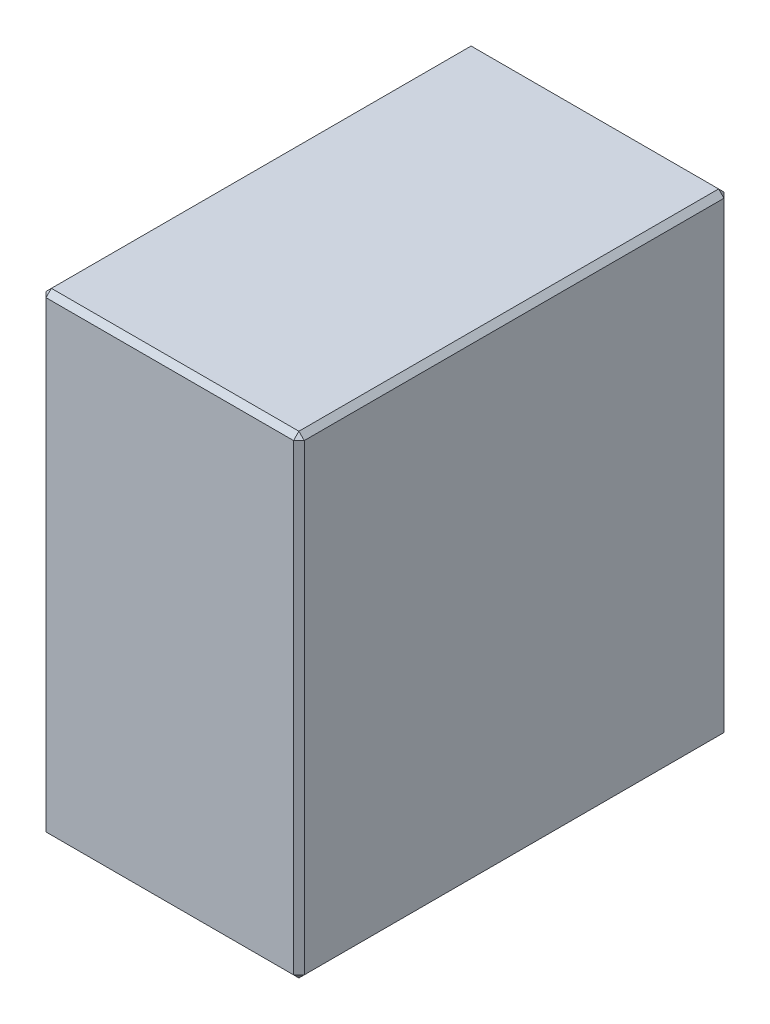
ISO-10303-21;
HEADER;
FILE_DESCRIPTION(('STEP AP214'),'2;1');
FILE_NAME('part.step','',(''),(''),'','','');
FILE_SCHEMA(('AUTOMOTIVE_DESIGN { 1 0 10303 214 1 1 1 1 }'));
ENDSEC;
DATA;
#1=APPLICATION_CONTEXT('core data for automotive mechanical design processes');
#2=APPLICATION_PROTOCOL_DEFINITION('international standard','automotive_design',2000,#1);
#3=PRODUCT_CONTEXT('',#1,'mechanical');
#4=PRODUCT('Part','Part','',(#3));
#5=PRODUCT_RELATED_PRODUCT_CATEGORY('part','',(#4));
#6=PRODUCT_DEFINITION_FORMATION('','',#4);
#7=PRODUCT_DEFINITION_CONTEXT('part definition',#1,'design');
#8=PRODUCT_DEFINITION('design','',#6,#7);
#9=PRODUCT_DEFINITION_SHAPE('','',#8);
#10=(LENGTH_UNIT() NAMED_UNIT(*) SI_UNIT(.MILLI.,.METRE.));
#11=(NAMED_UNIT(*) PLANE_ANGLE_UNIT() SI_UNIT($,.RADIAN.));
#12=(NAMED_UNIT(*) SI_UNIT($,.STERADIAN.) SOLID_ANGLE_UNIT());
#13=UNCERTAINTY_MEASURE_WITH_UNIT(LENGTH_MEASURE(1.E-05),#10,'distance_accuracy_value','');
#14=(GEOMETRIC_REPRESENTATION_CONTEXT(3) GLOBAL_UNCERTAINTY_ASSIGNED_CONTEXT((#13)) GLOBAL_UNIT_ASSIGNED_CONTEXT((#10,
#11,#12)) REPRESENTATION_CONTEXT('',''));
#15=CARTESIAN_POINT('',(0.,0.,0.));
#16=DIRECTION('',(0.,0.,1.));
#17=DIRECTION('',(1.,0.,0.));
#18=AXIS2_PLACEMENT_3D('',#15,#16,#17);
#19=CARTESIAN_POINT('',(-12.,22.,0.));
#20=DIRECTION('',(0.,0.,1.));
#21=DIRECTION('',(1.,0.,0.));
#22=AXIS2_PLACEMENT_3D('',#19,#20,#21);
#23=PLANE('',#22);
#24=DIRECTION('',(0.,1.,0.));
#25=VECTOR('',#24,1.);
#26=CARTESIAN_POINT('',(-0.250000000000004,22.,0.));
#27=LINE('',#26,#25);
#28=CARTESIAN_POINT('',(-0.250000000000004,0.250000000000004,0.));
#29=VERTEX_POINT('',#28);
#30=CARTESIAN_POINT('',(-0.250000000000004,21.75,0.));
#31=VERTEX_POINT('',#30);
#32=EDGE_CURVE('E182',#29,#31,#27,.T.);
#33=ORIENTED_EDGE('',*,*,#32,.T.);
#34=DIRECTION('',(-1.,0.,0.));
#35=VECTOR('',#34,1.);
#36=CARTESIAN_POINT('',(-12.,21.75,0.));
#37=LINE('',#36,#35);
#38=CARTESIAN_POINT('',(-11.75,21.75,0.));
#39=VERTEX_POINT('',#38);
#40=EDGE_CURVE('E186',#31,#39,#37,.T.);
#41=ORIENTED_EDGE('',*,*,#40,.T.);
#42=DIRECTION('',(0.,-1.,0.));
#43=VECTOR('',#42,1.);
#44=CARTESIAN_POINT('',(-11.75,0.,0.));
#45=LINE('',#44,#43);
#46=CARTESIAN_POINT('',(-11.75,0.250000000000004,0.));
#47=VERTEX_POINT('',#46);
#48=EDGE_CURVE('E184',#39,#47,#45,.T.);
#49=ORIENTED_EDGE('',*,*,#48,.T.);
#50=DIRECTION('',(1.,0.,0.));
#51=VECTOR('',#50,1.);
#52=CARTESIAN_POINT('',(-12.,0.250000000000004,0.));
#53=LINE('',#52,#51);
#54=EDGE_CURVE('E180',#47,#29,#53,.T.);
#55=ORIENTED_EDGE('',*,*,#54,.T.);
#56=EDGE_LOOP('',(#33,#41,#49,#55));
#57=FACE_BOUND('',#56,.T.);
#58=ADVANCED_FACE('F43',(#57),#23,.T.);
#59=CARTESIAN_POINT('',(-12.,22.,-20.));
#60=DIRECTION('',(0.,1.,0.));
#61=DIRECTION('',(0.,0.,1.));
#62=AXIS2_PLACEMENT_3D('',#59,#60,#61);
#63=PLANE('',#62);
#64=DIRECTION('',(0.,0.,1.));
#65=VECTOR('',#64,1.);
#66=CARTESIAN_POINT('',(-11.75,22.,0.));
#67=LINE('',#66,#65);
#68=CARTESIAN_POINT('',(-11.75,22.,-19.75));
#69=VERTEX_POINT('',#68);
#70=CARTESIAN_POINT('',(-11.75,22.,-0.250000000000004));
#71=VERTEX_POINT('',#70);
#72=EDGE_CURVE('E175',#69,#71,#67,.T.);
#73=ORIENTED_EDGE('',*,*,#72,.T.);
#74=DIRECTION('',(1.,0.,0.));
#75=VECTOR('',#74,1.);
#76=CARTESIAN_POINT('',(-12.,22.,-0.250000000000004));
#77=LINE('',#76,#75);
#78=CARTESIAN_POINT('',(-0.250000000000004,22.,-0.250000000000004));
#79=VERTEX_POINT('',#78);
#80=EDGE_CURVE('E177',#71,#79,#77,.T.);
#81=ORIENTED_EDGE('',*,*,#80,.T.);
#82=DIRECTION('',(0.,0.,-1.));
#83=VECTOR('',#82,1.);
#84=CARTESIAN_POINT('',(-0.250000000000004,22.,-20.));
#85=LINE('',#84,#83);
#86=CARTESIAN_POINT('',(-0.250000000000004,22.,-19.75));
#87=VERTEX_POINT('',#86);
#88=EDGE_CURVE('E171',#79,#87,#85,.T.);
#89=ORIENTED_EDGE('',*,*,#88,.T.);
#90=DIRECTION('',(-1.,0.,0.));
#91=VECTOR('',#90,1.);
#92=CARTESIAN_POINT('',(-12.,22.,-19.75));
#93=LINE('',#92,#91);
#94=EDGE_CURVE('E173',#87,#69,#93,.T.);
#95=ORIENTED_EDGE('',*,*,#94,.T.);
#96=EDGE_LOOP('',(#73,#81,#89,#95));
#97=FACE_BOUND('',#96,.T.);
#98=ADVANCED_FACE('F355',(#97),#63,.T.);
#99=CARTESIAN_POINT('',(-12.,0.,-20.));
#100=DIRECTION('',(0.,0.,-1.));
#101=DIRECTION('',(-1.,0.,0.));
#102=AXIS2_PLACEMENT_3D('',#99,#100,#101);
#103=PLANE('',#102);
#104=DIRECTION('',(0.,1.,0.));
#105=VECTOR('',#104,1.);
#106=CARTESIAN_POINT('',(-11.75,22.,-20.));
#107=LINE('',#106,#105);
#108=CARTESIAN_POINT('',(-11.75,0.250000000000004,-20.));
#109=VERTEX_POINT('',#108);
#110=CARTESIAN_POINT('',(-11.75,21.75,-20.));
#111=VERTEX_POINT('',#110);
#112=EDGE_CURVE('E202',#109,#111,#107,.T.);
#113=ORIENTED_EDGE('',*,*,#112,.T.);
#114=DIRECTION('',(1.,0.,0.));
#115=VECTOR('',#114,1.);
#116=CARTESIAN_POINT('',(-12.,21.75,-20.));
#117=LINE('',#116,#115);
#118=CARTESIAN_POINT('',(-0.250000000000004,21.75,-20.));
#119=VERTEX_POINT('',#118);
#120=EDGE_CURVE('E204',#111,#119,#117,.T.);
#121=ORIENTED_EDGE('',*,*,#120,.T.);
#122=DIRECTION('',(0.,-1.,0.));
#123=VECTOR('',#122,1.);
#124=CARTESIAN_POINT('',(-0.250000000000004,0.,-20.));
#125=LINE('',#124,#123);
#126=CARTESIAN_POINT('',(-0.250000000000004,0.250000000000004,-20.));
#127=VERTEX_POINT('',#126);
#128=EDGE_CURVE('E200',#119,#127,#125,.T.);
#129=ORIENTED_EDGE('',*,*,#128,.T.);
#130=DIRECTION('',(-1.,0.,0.));
#131=VECTOR('',#130,1.);
#132=CARTESIAN_POINT('',(-12.,0.250000000000004,-20.));
#133=LINE('',#132,#131);
#134=EDGE_CURVE('E198',#127,#109,#133,.T.);
#135=ORIENTED_EDGE('',*,*,#134,.T.);
#136=EDGE_LOOP('',(#113,#121,#129,#135));
#137=FACE_BOUND('',#136,.T.);
#138=CARTESIAN_POINT('',(-6.,17.,-20.));
#139=DIRECTION('',(0.,0.,-1.));
#140=DIRECTION('',(-1.,0.,0.));
#141=AXIS2_PLACEMENT_3D('',#138,#139,#140);
#142=CIRCLE('',#141,2.46);
#143=CARTESIAN_POINT('',(-8.46,17.,-20.));
#144=VERTEX_POINT('',#143);
#145=EDGE_CURVE('E165',#144,#144,#142,.T.);
#146=ORIENTED_EDGE('',*,*,#145,.F.);
#147=EDGE_LOOP('',(#146));
#148=FACE_BOUND('',#147,.T.);
#149=ADVANCED_FACE('F307',(#137,#148),#103,.T.);
#150=CARTESIAN_POINT('',(-12.,0.,0.));
#151=DIRECTION('',(0.,-1.,0.));
#152=DIRECTION('',(0.,0.,-1.));
#153=AXIS2_PLACEMENT_3D('',#150,#151,#152);
#154=PLANE('',#153);
#155=DIRECTION('',(0.,0.,1.));
#156=VECTOR('',#155,1.);
#157=CARTESIAN_POINT('',(-0.250000000000004,0.,0.));
#158=LINE('',#157,#156);
#159=CARTESIAN_POINT('',(-0.250000000000004,0.,-19.75));
#160=VERTEX_POINT('',#159);
#161=CARTESIAN_POINT('',(-0.250000000000004,0.,-0.250000000000004));
#162=VERTEX_POINT('',#161);
#163=EDGE_CURVE('E68',#160,#162,#158,.T.);
#164=ORIENTED_EDGE('',*,*,#163,.T.);
#165=DIRECTION('',(-1.,0.,0.));
#166=VECTOR('',#165,1.);
#167=CARTESIAN_POINT('',(-12.,0.,-0.250000000000004));
#168=LINE('',#167,#166);
#169=CARTESIAN_POINT('',(-11.75,0.,-0.250000000000004));
#170=VERTEX_POINT('',#169);
#171=EDGE_CURVE('E11',#162,#170,#168,.T.);
#172=ORIENTED_EDGE('',*,*,#171,.T.);
#173=DIRECTION('',(0.,0.,-1.));
#174=VECTOR('',#173,1.);
#175=CARTESIAN_POINT('',(-11.75,0.,-20.));
#176=LINE('',#175,#174);
#177=CARTESIAN_POINT('',(-11.75,0.,-19.75));
#178=VERTEX_POINT('',#177);
#179=EDGE_CURVE('E53',#170,#178,#176,.T.);
#180=ORIENTED_EDGE('',*,*,#179,.T.);
#181=DIRECTION('',(1.,0.,0.));
#182=VECTOR('',#181,1.);
#183=CARTESIAN_POINT('',(-12.,0.,-19.75));
#184=LINE('',#183,#182);
#185=EDGE_CURVE('E216',#178,#160,#184,.T.);
#186=ORIENTED_EDGE('',*,*,#185,.T.);
#187=EDGE_LOOP('',(#164,#172,#180,#186));
#188=FACE_BOUND('',#187,.T.);
#189=CARTESIAN_POINT('',(-6.,0.,-16.));
#190=DIRECTION('',(0.,-1.,0.));
#191=DIRECTION('',(0.,0.,-1.));
#192=AXIS2_PLACEMENT_3D('',#189,#190,#191);
#193=CIRCLE('',#192,2.06499999999999);
#194=CARTESIAN_POINT('',(-6.,0.,-18.065));
#195=VERTEX_POINT('',#194);
#196=EDGE_CURVE('E155',#195,#195,#193,.T.);
#197=ORIENTED_EDGE('',*,*,#196,.F.);
#198=EDGE_LOOP('',(#197));
#199=FACE_BOUND('',#198,.T.);
#200=CARTESIAN_POINT('',(-6.,0.,-6.));
#201=DIRECTION('',(0.,-1.,0.));
#202=DIRECTION('',(0.,0.,-1.));
#203=AXIS2_PLACEMENT_3D('',#200,#201,#202);
#204=CIRCLE('',#203,2.06499999999999);
#205=CARTESIAN_POINT('',(-6.,0.,-8.06499999999999));
#206=VERTEX_POINT('',#205);
#207=EDGE_CURVE('E154',#206,#206,#204,.T.);
#208=ORIENTED_EDGE('',*,*,#207,.F.);
#209=EDGE_LOOP('',(#208));
#210=FACE_BOUND('',#209,.T.);
#211=ADVANCED_FACE('F335',(#188,#199,#210),#154,.T.);
#212=CARTESIAN_POINT('',(-12.,0.,0.));
#213=DIRECTION('',(1.,0.,0.));
#214=DIRECTION('',(0.,0.,-1.));
#215=AXIS2_PLACEMENT_3D('',#212,#213,#214);
#216=PLANE('',#215);
#217=DIRECTION('',(0.,1.,0.));
#218=VECTOR('',#217,1.);
#219=CARTESIAN_POINT('',(-12.,22.,-0.250000000000004));
#220=LINE('',#219,#218);
#221=CARTESIAN_POINT('',(-12.,0.250000000000004,-0.250000000000004));
#222=VERTEX_POINT('',#221);
#223=CARTESIAN_POINT('',(-12.,21.75,-0.250000000000004));
#224=VERTEX_POINT('',#223);
#225=EDGE_CURVE('E193',#222,#224,#220,.T.);
#226=ORIENTED_EDGE('',*,*,#225,.T.);
#227=DIRECTION('',(0.,0.,-1.));
#228=VECTOR('',#227,1.);
#229=CARTESIAN_POINT('',(-12.,21.75,-20.));
#230=LINE('',#229,#228);
#231=CARTESIAN_POINT('',(-12.,21.75,-19.75));
#232=VERTEX_POINT('',#231);
#233=EDGE_CURVE('E195',#224,#232,#230,.T.);
#234=ORIENTED_EDGE('',*,*,#233,.T.);
#235=DIRECTION('',(0.,-1.,0.));
#236=VECTOR('',#235,1.);
#237=CARTESIAN_POINT('',(-12.,0.,-19.75));
#238=LINE('',#237,#236);
#239=CARTESIAN_POINT('',(-12.,0.250000000000004,-19.75));
#240=VERTEX_POINT('',#239);
#241=EDGE_CURVE('E191',#232,#240,#238,.T.);
#242=ORIENTED_EDGE('',*,*,#241,.T.);
#243=DIRECTION('',(0.,0.,1.));
#244=VECTOR('',#243,1.);
#245=CARTESIAN_POINT('',(-12.,0.250000000000004,0.));
#246=LINE('',#245,#244);
#247=EDGE_CURVE('E189',#240,#222,#246,.T.);
#248=ORIENTED_EDGE('',*,*,#247,.T.);
#249=EDGE_LOOP('',(#226,#234,#242,#248));
#250=FACE_BOUND('',#249,.T.);
#251=ADVANCED_FACE('F298',(#250),#216,.F.);
#252=CARTESIAN_POINT('',(0.,0.,0.));
#253=DIRECTION('',(1.,0.,0.));
#254=DIRECTION('',(0.,0.,-1.));
#255=AXIS2_PLACEMENT_3D('',#252,#253,#254);
#256=PLANE('',#255);
#257=DIRECTION('',(0.,1.,0.));
#258=VECTOR('',#257,1.);
#259=CARTESIAN_POINT('',(0.,0.,-19.75));
#260=LINE('',#259,#258);
#261=CARTESIAN_POINT('',(0.,0.250000000000004,-19.75));
#262=VERTEX_POINT('',#261);
#263=CARTESIAN_POINT('',(0.,21.75,-19.75));
#264=VERTEX_POINT('',#263);
#265=EDGE_CURVE('E209',#262,#264,#260,.T.);
#266=ORIENTED_EDGE('',*,*,#265,.T.);
#267=DIRECTION('',(0.,0.,1.));
#268=VECTOR('',#267,1.);
#269=CARTESIAN_POINT('',(0.,21.75,0.));
#270=LINE('',#269,#268);
#271=CARTESIAN_POINT('',(0.,21.75,-0.250000000000004));
#272=VERTEX_POINT('',#271);
#273=EDGE_CURVE('E213',#264,#272,#270,.T.);
#274=ORIENTED_EDGE('',*,*,#273,.T.);
#275=DIRECTION('',(0.,-1.,0.));
#276=VECTOR('',#275,1.);
#277=CARTESIAN_POINT('',(0.,0.,-0.250000000000004));
#278=LINE('',#277,#276);
#279=CARTESIAN_POINT('',(0.,0.250000000000004,-0.250000000000004));
#280=VERTEX_POINT('',#279);
#281=EDGE_CURVE('E211',#272,#280,#278,.T.);
#282=ORIENTED_EDGE('',*,*,#281,.T.);
#283=DIRECTION('',(0.,0.,-1.));
#284=VECTOR('',#283,1.);
#285=CARTESIAN_POINT('',(0.,0.250000000000004,0.));
#286=LINE('',#285,#284);
#287=EDGE_CURVE('E207',#280,#262,#286,.T.);
#288=ORIENTED_EDGE('',*,*,#287,.T.);
#289=EDGE_LOOP('',(#266,#274,#282,#288));
#290=FACE_BOUND('',#289,.T.);
#291=ADVANCED_FACE('F519',(#290),#256,.T.);
#292=CARTESIAN_POINT('',(-6.,17.,-9.00000000000001));
#293=DIRECTION('',(0.,0.,-1.));
#294=DIRECTION('',(-1.,0.,0.));
#295=AXIS2_PLACEMENT_3D('',#292,#293,#294);
#296=CONICAL_SURFACE('',#295,2.46,1.02974425867665);
#297=CARTESIAN_POINT('',(-6.,17.,-7.5218828771922));
#298=VERTEX_POINT('',#297);
#299=VERTEX_LOOP('',#298);
#300=FACE_BOUND('',#299,.T.);
#301=CARTESIAN_POINT('',(-6.,17.,-9.00000000000001));
#302=DIRECTION('',(0.,0.,-1.));
#303=DIRECTION('',(-1.,0.,0.));
#304=AXIS2_PLACEMENT_3D('',#301,#302,#303);
#305=CIRCLE('',#304,2.46);
#306=CARTESIAN_POINT('',(-8.46,17.,-9.00000000000001));
#307=VERTEX_POINT('',#306);
#308=EDGE_CURVE('E168',#307,#307,#305,.T.);
#309=ORIENTED_EDGE('',*,*,#308,.T.);
#310=EDGE_LOOP('',(#309));
#311=FACE_BOUND('',#310,.T.);
#312=ADVANCED_FACE('F509',(#300,#311),#296,.F.);
#313=CARTESIAN_POINT('',(-6.,17.,-20.));
#314=DIRECTION('',(0.,0.,-1.));
#315=DIRECTION('',(-1.,0.,0.));
#316=AXIS2_PLACEMENT_3D('',#313,#314,#315);
#317=CYLINDRICAL_SURFACE('',#316,2.46);
#318=ORIENTED_EDGE('',*,*,#308,.F.);
#319=EDGE_LOOP('',(#318));
#320=FACE_BOUND('',#319,.T.);
#321=ORIENTED_EDGE('',*,*,#145,.T.);
#322=EDGE_LOOP('',(#321));
#323=FACE_BOUND('',#322,.T.);
#324=ADVANCED_FACE('F350',(#320,#323),#317,.F.);
#325=CARTESIAN_POINT('',(-6.,12.,-6.));
#326=DIRECTION('',(0.,-1.,0.));
#327=DIRECTION('',(0.,0.,-1.));
#328=AXIS2_PLACEMENT_3D('',#325,#326,#327);
#329=CONICAL_SURFACE('',#328,2.06499999999999,1.02974425867665);
#330=CARTESIAN_POINT('',(-6.,13.2407771782919,-6.));
#331=VERTEX_POINT('',#330);
#332=VERTEX_LOOP('',#331);
#333=FACE_BOUND('',#332,.T.);
#334=CARTESIAN_POINT('',(-6.,12.,-6.));
#335=DIRECTION('',(0.,-1.,0.));
#336=DIRECTION('',(0.,0.,-1.));
#337=AXIS2_PLACEMENT_3D('',#334,#335,#336);
#338=CIRCLE('',#337,2.06499999999999);
#339=CARTESIAN_POINT('',(-6.,12.,-8.06499999999999));
#340=VERTEX_POINT('',#339);
#341=EDGE_CURVE('E158',#340,#340,#338,.T.);
#342=ORIENTED_EDGE('',*,*,#341,.T.);
#343=EDGE_LOOP('',(#342));
#344=FACE_BOUND('',#343,.T.);
#345=ADVANCED_FACE('F344',(#333,#344),#329,.F.);
#346=CARTESIAN_POINT('',(-6.,0.,-6.));
#347=DIRECTION('',(0.,-1.,0.));
#348=DIRECTION('',(0.,0.,-1.));
#349=AXIS2_PLACEMENT_3D('',#346,#347,#348);
#350=CYLINDRICAL_SURFACE('',#349,2.06499999999999);
#351=ORIENTED_EDGE('',*,*,#341,.F.);
#352=EDGE_LOOP('',(#351));
#353=FACE_BOUND('',#352,.T.);
#354=ORIENTED_EDGE('',*,*,#207,.T.);
#355=EDGE_LOOP('',(#354));
#356=FACE_BOUND('',#355,.T.);
#357=ADVANCED_FACE('F148',(#353,#356),#350,.F.);
#358=CARTESIAN_POINT('',(-6.,12.,-16.));
#359=DIRECTION('',(0.,-1.,0.));
#360=DIRECTION('',(0.,0.,-1.));
#361=AXIS2_PLACEMENT_3D('',#358,#359,#360);
#362=CONICAL_SURFACE('',#361,2.06499999999999,1.02974425867665);
#363=CARTESIAN_POINT('',(-6.,13.2407771782919,-16.));
#364=VERTEX_POINT('',#363);
#365=VERTEX_LOOP('',#364);
#366=FACE_BOUND('',#365,.T.);
#367=CARTESIAN_POINT('',(-6.,12.,-16.));
#368=DIRECTION('',(0.,-1.,0.));
#369=DIRECTION('',(0.,0.,-1.));
#370=AXIS2_PLACEMENT_3D('',#367,#368,#369);
#371=CIRCLE('',#370,2.06499999999999);
#372=CARTESIAN_POINT('',(-6.,12.,-18.065));
#373=VERTEX_POINT('',#372);
#374=EDGE_CURVE('E152',#373,#373,#371,.T.);
#375=ORIENTED_EDGE('',*,*,#374,.T.);
#376=EDGE_LOOP('',(#375));
#377=FACE_BOUND('',#376,.T.);
#378=ADVANCED_FACE('F144',(#366,#377),#362,.F.);
#379=CARTESIAN_POINT('',(-6.,0.,-16.));
#380=DIRECTION('',(0.,-1.,0.));
#381=DIRECTION('',(0.,0.,-1.));
#382=AXIS2_PLACEMENT_3D('',#379,#380,#381);
#383=CYLINDRICAL_SURFACE('',#382,2.06499999999999);
#384=ORIENTED_EDGE('',*,*,#374,.F.);
#385=EDGE_LOOP('',(#384));
#386=FACE_BOUND('',#385,.T.);
#387=ORIENTED_EDGE('',*,*,#196,.T.);
#388=EDGE_LOOP('',(#387));
#389=FACE_BOUND('',#388,.T.);
#390=ADVANCED_FACE('F147',(#386,#389),#383,.F.);
#391=CARTESIAN_POINT('',(-12.,0.,-19.75));
#392=DIRECTION('',(0.,0.707106781186547,0.707106781186547));
#393=DIRECTION('',(1.,0.,0.));
#394=AXIS2_PLACEMENT_3D('',#391,#392,#393);
#395=PLANE('',#394);
#396=DIRECTION('',(0.,0.707106781186547,-0.707106781186547));
#397=VECTOR('',#396,1.);
#398=CARTESIAN_POINT('',(-11.75,0.125000000000002,-19.875));
#399=LINE('',#398,#397);
#400=EDGE_CURVE('E48',#109,#178,#399,.F.);
#401=ORIENTED_EDGE('',*,*,#400,.F.);
#402=ORIENTED_EDGE('',*,*,#134,.F.);
#403=DIRECTION('',(0.,-0.707106781186547,0.707106781186547));
#404=VECTOR('',#403,1.);
#405=CARTESIAN_POINT('',(-0.250000000000004,0.250000000000004,-20.));
#406=LINE('',#405,#404);
#407=EDGE_CURVE('E277',#160,#127,#406,.F.);
#408=ORIENTED_EDGE('',*,*,#407,.F.);
#409=ORIENTED_EDGE('',*,*,#185,.F.);
#410=EDGE_LOOP('',(#401,#402,#408,#409));
#411=FACE_BOUND('',#410,.T.);
#412=ADVANCED_FACE('F46',(#411),#395,.F.);
#413=CARTESIAN_POINT('',(-12.,0.250000000000004,-19.75));
#414=DIRECTION('',(-0.577350269189626,-0.577350269189626,-0.577350269189626));
#415=DIRECTION('',(-0.707106781186547,0.,0.707106781186547));
#416=AXIS2_PLACEMENT_3D('',#413,#414,#415);
#417=PLANE('',#416);
#418=DIRECTION('',(0.707106781186547,0.,-0.707106781186547));
#419=VECTOR('',#418,1.);
#420=CARTESIAN_POINT('',(-12.,0.250000000000004,-19.75));
#421=LINE('',#420,#419);
#422=EDGE_CURVE('E272',#109,#240,#421,.F.);
#423=ORIENTED_EDGE('',*,*,#422,.F.);
#424=ORIENTED_EDGE('',*,*,#400,.T.);
#425=DIRECTION('',(-0.707106781186547,0.707106781186547,0.));
#426=VECTOR('',#425,1.);
#427=CARTESIAN_POINT('',(-12.,0.250000000000004,-19.75));
#428=LINE('',#427,#426);
#429=EDGE_CURVE('E275',#240,#178,#428,.F.);
#430=ORIENTED_EDGE('',*,*,#429,.F.);
#431=EDGE_LOOP('',(#423,#424,#430));
#432=FACE_BOUND('',#431,.T.);
#433=ADVANCED_FACE('F288',(#432),#417,.T.);
#434=CARTESIAN_POINT('',(-0.250000000000004,0.250000000000004,-20.));
#435=DIRECTION('',(0.577350269189626,-0.577350269189626,-0.577350269189626));
#436=DIRECTION('',(-0.707106781186547,0.,-0.707106781186547));
#437=AXIS2_PLACEMENT_3D('',#434,#435,#436);
#438=PLANE('',#437);
#439=DIRECTION('',(0.707106781186547,0.707106781186547,0.));
#440=VECTOR('',#439,1.);
#441=CARTESIAN_POINT('',(-0.125000000000002,0.125000000000002,-19.75));
#442=LINE('',#441,#440);
#443=EDGE_CURVE('E266',#160,#262,#442,.T.);
#444=ORIENTED_EDGE('',*,*,#443,.F.);
#445=ORIENTED_EDGE('',*,*,#407,.T.);
#446=DIRECTION('',(-0.707106781186547,0.,-0.707106781186547));
#447=VECTOR('',#446,1.);
#448=CARTESIAN_POINT('',(-0.250000000000004,0.250000000000004,-20.));
#449=LINE('',#448,#447);
#450=EDGE_CURVE('E269',#262,#127,#449,.T.);
#451=ORIENTED_EDGE('',*,*,#450,.F.);
#452=EDGE_LOOP('',(#444,#445,#451));
#453=FACE_BOUND('',#452,.T.);
#454=ADVANCED_FACE('F322',(#453),#438,.T.);
#455=CARTESIAN_POINT('',(-11.75,0.,0.));
#456=DIRECTION('',(-0.707106781186547,-0.707106781186547,0.));
#457=DIRECTION('',(0.,0.,1.));
#458=AXIS2_PLACEMENT_3D('',#455,#456,#457);
#459=PLANE('',#458);
#460=ORIENTED_EDGE('',*,*,#429,.T.);
#461=ORIENTED_EDGE('',*,*,#179,.F.);
#462=DIRECTION('',(0.707106781186547,-0.707106781186547,0.));
#463=VECTOR('',#462,1.);
#464=CARTESIAN_POINT('',(-11.875,0.125000000000002,-0.250000000000004));
#465=LINE('',#464,#463);
#466=EDGE_CURVE('E61',#222,#170,#465,.T.);
#467=ORIENTED_EDGE('',*,*,#466,.F.);
#468=ORIENTED_EDGE('',*,*,#247,.F.);
#469=EDGE_LOOP('',(#460,#461,#467,#468));
#470=FACE_BOUND('',#469,.T.);
#471=ADVANCED_FACE('F296',(#470),#459,.T.);
#472=CARTESIAN_POINT('',(-11.75,0.,-20.));
#473=DIRECTION('',(-0.707106781186547,0.,-0.707106781186547));
#474=DIRECTION('',(0.,-1.,0.));
#475=AXIS2_PLACEMENT_3D('',#472,#473,#474);
#476=PLANE('',#475);
#477=ORIENTED_EDGE('',*,*,#422,.T.);
#478=ORIENTED_EDGE('',*,*,#241,.F.);
#479=DIRECTION('',(-0.707106781186547,0.,0.707106781186547));
#480=VECTOR('',#479,1.);
#481=CARTESIAN_POINT('',(-12.,21.75,-19.75));
#482=LINE('',#481,#480);
#483=EDGE_CURVE('E260',#111,#232,#482,.T.);
#484=ORIENTED_EDGE('',*,*,#483,.F.);
#485=ORIENTED_EDGE('',*,*,#112,.F.);
#486=EDGE_LOOP('',(#477,#478,#484,#485));
#487=FACE_BOUND('',#486,.T.);
#488=ADVANCED_FACE('F304',(#487),#476,.T.);
#489=CARTESIAN_POINT('',(-12.,21.75,-20.));
#490=DIRECTION('',(0.,-0.707106781186547,0.707106781186547));
#491=DIRECTION('',(1.,0.,0.));
#492=AXIS2_PLACEMENT_3D('',#489,#490,#491);
#493=PLANE('',#492);
#494=DIRECTION('',(0.,-0.707106781186547,-0.707106781186547));
#495=VECTOR('',#494,1.);
#496=CARTESIAN_POINT('',(-0.250000000000004,21.75,-20.));
#497=LINE('',#496,#495);
#498=EDGE_CURVE('E254',#119,#87,#497,.F.);
#499=ORIENTED_EDGE('',*,*,#498,.F.);
#500=ORIENTED_EDGE('',*,*,#120,.F.);
#501=DIRECTION('',(0.,0.707106781186547,0.707106781186547));
#502=VECTOR('',#501,1.);
#503=CARTESIAN_POINT('',(-11.75,21.875,-19.875));
#504=LINE('',#503,#502);
#505=EDGE_CURVE('E257',#69,#111,#504,.F.);
#506=ORIENTED_EDGE('',*,*,#505,.F.);
#507=ORIENTED_EDGE('',*,*,#94,.F.);
#508=EDGE_LOOP('',(#499,#500,#506,#507));
#509=FACE_BOUND('',#508,.T.);
#510=ADVANCED_FACE('F312',(#509),#493,.F.);
#511=CARTESIAN_POINT('',(0.,0.,-19.75));
#512=DIRECTION('',(-0.707106781186547,0.,0.707106781186547));
#513=DIRECTION('',(0.,1.,0.));
#514=AXIS2_PLACEMENT_3D('',#511,#512,#513);
#515=PLANE('',#514);
#516=ORIENTED_EDGE('',*,*,#450,.T.);
#517=ORIENTED_EDGE('',*,*,#128,.F.);
#518=DIRECTION('',(0.707106781186547,0.,0.707106781186547));
#519=VECTOR('',#518,1.);
#520=CARTESIAN_POINT('',(-0.250000000000004,21.75,-20.));
#521=LINE('',#520,#519);
#522=EDGE_CURVE('E252',#264,#119,#521,.F.);
#523=ORIENTED_EDGE('',*,*,#522,.F.);
#524=ORIENTED_EDGE('',*,*,#265,.F.);
#525=EDGE_LOOP('',(#516,#517,#523,#524));
#526=FACE_BOUND('',#525,.T.);
#527=ADVANCED_FACE('F320',(#526),#515,.F.);
#528=CARTESIAN_POINT('',(0.,0.250000000000004,0.));
#529=DIRECTION('',(-0.707106781186547,0.707106781186547,0.));
#530=DIRECTION('',(0.,0.,-1.));
#531=AXIS2_PLACEMENT_3D('',#528,#529,#530);
#532=PLANE('',#531);
#533=ORIENTED_EDGE('',*,*,#443,.T.);
#534=ORIENTED_EDGE('',*,*,#287,.F.);
#535=DIRECTION('',(-0.707106781186547,-0.707106781186547,0.));
#536=VECTOR('',#535,1.);
#537=CARTESIAN_POINT('',(0.,0.250000000000004,-0.250000000000004));
#538=LINE('',#537,#536);
#539=EDGE_CURVE('E249',#162,#280,#538,.F.);
#540=ORIENTED_EDGE('',*,*,#539,.F.);
#541=ORIENTED_EDGE('',*,*,#163,.F.);
#542=EDGE_LOOP('',(#533,#534,#540,#541));
#543=FACE_BOUND('',#542,.T.);
#544=ADVANCED_FACE('F326',(#543),#532,.F.);
#545=CARTESIAN_POINT('',(-12.,0.250000000000004,0.));
#546=DIRECTION('',(0.,0.707106781186547,-0.707106781186547));
#547=DIRECTION('',(1.,0.,0.));
#548=AXIS2_PLACEMENT_3D('',#545,#546,#547);
#549=PLANE('',#548);
#550=DIRECTION('',(0.,-0.707106781186547,-0.707106781186547));
#551=VECTOR('',#550,1.);
#552=CARTESIAN_POINT('',(-11.75,0.250000000000004,0.));
#553=LINE('',#552,#551);
#554=EDGE_CURVE('E264',#170,#47,#553,.F.);
#555=ORIENTED_EDGE('',*,*,#554,.F.);
#556=ORIENTED_EDGE('',*,*,#171,.F.);
#557=DIRECTION('',(0.,0.707106781186547,0.707106781186547));
#558=VECTOR('',#557,1.);
#559=CARTESIAN_POINT('',(-0.250000000000004,0.125000000000002,-0.125000000000002));
#560=LINE('',#559,#558);
#561=EDGE_CURVE('E246',#29,#162,#560,.F.);
#562=ORIENTED_EDGE('',*,*,#561,.F.);
#563=ORIENTED_EDGE('',*,*,#54,.F.);
#564=EDGE_LOOP('',(#555,#556,#562,#563));
#565=FACE_BOUND('',#564,.T.);
#566=ADVANCED_FACE('F334',(#565),#549,.F.);
#567=CARTESIAN_POINT('',(-11.75,0.250000000000004,0.));
#568=DIRECTION('',(-0.577350269189626,-0.577350269189626,0.577350269189626));
#569=DIRECTION('',(0.707106781186547,0.,0.707106781186547));
#570=AXIS2_PLACEMENT_3D('',#567,#568,#569);
#571=PLANE('',#570);
#572=ORIENTED_EDGE('',*,*,#466,.T.);
#573=ORIENTED_EDGE('',*,*,#554,.T.);
#574=DIRECTION('',(-0.707106781186547,0.,-0.707106781186547));
#575=VECTOR('',#574,1.);
#576=CARTESIAN_POINT('',(-11.75,0.250000000000004,0.));
#577=LINE('',#576,#575);
#578=EDGE_CURVE('E243',#222,#47,#577,.F.);
#579=ORIENTED_EDGE('',*,*,#578,.F.);
#580=EDGE_LOOP('',(#572,#573,#579));
#581=FACE_BOUND('',#580,.T.);
#582=ADVANCED_FACE('F432',(#581),#571,.T.);
#583=CARTESIAN_POINT('',(-12.,21.75,-19.75));
#584=DIRECTION('',(-0.577350269189626,0.577350269189626,-0.577350269189626));
#585=DIRECTION('',(-0.707106781186547,0.,0.707106781186547));
#586=AXIS2_PLACEMENT_3D('',#583,#584,#585);
#587=PLANE('',#586);
#588=ORIENTED_EDGE('',*,*,#505,.T.);
#589=ORIENTED_EDGE('',*,*,#483,.T.);
#590=DIRECTION('',(0.707106781186547,0.707106781186547,0.));
#591=VECTOR('',#590,1.);
#592=CARTESIAN_POINT('',(-12.,21.75,-19.75));
#593=LINE('',#592,#591);
#594=EDGE_CURVE('E241',#69,#232,#593,.F.);
#595=ORIENTED_EDGE('',*,*,#594,.F.);
#596=EDGE_LOOP('',(#588,#589,#595));
#597=FACE_BOUND('',#596,.T.);
#598=ADVANCED_FACE('F426',(#597),#587,.T.);
#599=CARTESIAN_POINT('',(-0.250000000000004,21.75,-20.));
#600=DIRECTION('',(0.577350269189626,0.577350269189626,-0.577350269189626));
#601=DIRECTION('',(-0.707106781186547,0.,-0.707106781186547));
#602=AXIS2_PLACEMENT_3D('',#599,#600,#601);
#603=PLANE('',#602);
#604=ORIENTED_EDGE('',*,*,#522,.T.);
#605=ORIENTED_EDGE('',*,*,#498,.T.);
#606=DIRECTION('',(-0.707106781186547,0.707106781186547,0.));
#607=VECTOR('',#606,1.);
#608=CARTESIAN_POINT('',(-0.125000000000002,21.875,-19.75));
#609=LINE('',#608,#607);
#610=EDGE_CURVE('E238',#264,#87,#609,.T.);
#611=ORIENTED_EDGE('',*,*,#610,.F.);
#612=EDGE_LOOP('',(#604,#605,#611));
#613=FACE_BOUND('',#612,.T.);
#614=ADVANCED_FACE('F420',(#613),#603,.T.);
#615=CARTESIAN_POINT('',(0.,0.250000000000004,-0.250000000000004));
#616=DIRECTION('',(0.577350269189626,-0.577350269189626,0.577350269189626));
#617=DIRECTION('',(0.707106781186547,0.,-0.707106781186547));
#618=AXIS2_PLACEMENT_3D('',#615,#616,#617);
#619=PLANE('',#618);
#620=ORIENTED_EDGE('',*,*,#561,.T.);
#621=ORIENTED_EDGE('',*,*,#539,.T.);
#622=DIRECTION('',(0.707106781186547,0.,-0.707106781186547));
#623=VECTOR('',#622,1.);
#624=CARTESIAN_POINT('',(0.,0.250000000000004,-0.250000000000004));
#625=LINE('',#624,#623);
#626=EDGE_CURVE('E235',#29,#280,#625,.T.);
#627=ORIENTED_EDGE('',*,*,#626,.F.);
#628=EDGE_LOOP('',(#620,#621,#627));
#629=FACE_BOUND('',#628,.T.);
#630=ADVANCED_FACE('F330',(#629),#619,.T.);
#631=CARTESIAN_POINT('',(-11.75,22.,0.));
#632=DIRECTION('',(-0.707106781186547,0.,0.707106781186547));
#633=DIRECTION('',(0.,1.,0.));
#634=AXIS2_PLACEMENT_3D('',#631,#632,#633);
#635=PLANE('',#634);
#636=ORIENTED_EDGE('',*,*,#578,.T.);
#637=ORIENTED_EDGE('',*,*,#48,.F.);
#638=DIRECTION('',(0.707106781186547,0.,0.707106781186547));
#639=VECTOR('',#638,1.);
#640=CARTESIAN_POINT('',(-11.75,21.75,0.));
#641=LINE('',#640,#639);
#642=EDGE_CURVE('E232',#224,#39,#641,.T.);
#643=ORIENTED_EDGE('',*,*,#642,.F.);
#644=ORIENTED_EDGE('',*,*,#225,.F.);
#645=EDGE_LOOP('',(#636,#637,#643,#644));
#646=FACE_BOUND('',#645,.T.);
#647=ADVANCED_FACE('F407',(#646),#635,.T.);
#648=CARTESIAN_POINT('',(-11.75,22.,-20.));
#649=DIRECTION('',(-0.707106781186547,0.707106781186547,0.));
#650=DIRECTION('',(0.,0.,-1.));
#651=AXIS2_PLACEMENT_3D('',#648,#649,#650);
#652=PLANE('',#651);
#653=ORIENTED_EDGE('',*,*,#594,.T.);
#654=ORIENTED_EDGE('',*,*,#233,.F.);
#655=DIRECTION('',(-0.707106781186547,-0.707106781186547,0.));
#656=VECTOR('',#655,1.);
#657=CARTESIAN_POINT('',(-11.875,21.875,-0.250000000000004));
#658=LINE('',#657,#656);
#659=EDGE_CURVE('E229',#71,#224,#658,.T.);
#660=ORIENTED_EDGE('',*,*,#659,.F.);
#661=ORIENTED_EDGE('',*,*,#72,.F.);
#662=EDGE_LOOP('',(#653,#654,#660,#661));
#663=FACE_BOUND('',#662,.T.);
#664=ADVANCED_FACE('F400',(#663),#652,.T.);
#665=CARTESIAN_POINT('',(0.,21.75,0.));
#666=DIRECTION('',(-0.707106781186547,-0.707106781186547,0.));
#667=DIRECTION('',(0.,0.,1.));
#668=AXIS2_PLACEMENT_3D('',#665,#666,#667);
#669=PLANE('',#668);
#670=ORIENTED_EDGE('',*,*,#610,.T.);
#671=ORIENTED_EDGE('',*,*,#88,.F.);
#672=DIRECTION('',(0.707106781186547,-0.707106781186547,0.));
#673=VECTOR('',#672,1.);
#674=CARTESIAN_POINT('',(-0.250000000000004,22.,-0.250000000000004));
#675=LINE('',#674,#673);
#676=EDGE_CURVE('E226',#272,#79,#675,.F.);
#677=ORIENTED_EDGE('',*,*,#676,.F.);
#678=ORIENTED_EDGE('',*,*,#273,.F.);
#679=EDGE_LOOP('',(#670,#671,#677,#678));
#680=FACE_BOUND('',#679,.T.);
#681=ADVANCED_FACE('F393',(#680),#669,.F.);
#682=CARTESIAN_POINT('',(0.,0.,-0.250000000000004));
#683=DIRECTION('',(-0.707106781186547,0.,-0.707106781186547));
#684=DIRECTION('',(0.,-1.,0.));
#685=AXIS2_PLACEMENT_3D('',#682,#683,#684);
#686=PLANE('',#685);
#687=ORIENTED_EDGE('',*,*,#626,.T.);
#688=ORIENTED_EDGE('',*,*,#281,.F.);
#689=DIRECTION('',(-0.707106781186547,0.,0.707106781186547));
#690=VECTOR('',#689,1.);
#691=CARTESIAN_POINT('',(-0.125000000000002,21.75,-0.125000000000002));
#692=LINE('',#691,#690);
#693=EDGE_CURVE('E224',#31,#272,#692,.F.);
#694=ORIENTED_EDGE('',*,*,#693,.F.);
#695=ORIENTED_EDGE('',*,*,#32,.F.);
#696=EDGE_LOOP('',(#687,#688,#694,#695));
#697=FACE_BOUND('',#696,.T.);
#698=ADVANCED_FACE('F386',(#697),#686,.F.);
#699=CARTESIAN_POINT('',(-11.75,21.75,0.));
#700=DIRECTION('',(-0.577350269189626,0.577350269189626,0.577350269189626));
#701=DIRECTION('',(0.707106781186547,0.,0.707106781186547));
#702=AXIS2_PLACEMENT_3D('',#699,#700,#701);
#703=PLANE('',#702);
#704=ORIENTED_EDGE('',*,*,#659,.T.);
#705=ORIENTED_EDGE('',*,*,#642,.T.);
#706=DIRECTION('',(0.,-0.707106781186547,0.707106781186547));
#707=VECTOR('',#706,1.);
#708=CARTESIAN_POINT('',(-11.75,21.75,0.));
#709=LINE('',#708,#707);
#710=EDGE_CURVE('E222',#71,#39,#709,.T.);
#711=ORIENTED_EDGE('',*,*,#710,.F.);
#712=EDGE_LOOP('',(#704,#705,#711));
#713=FACE_BOUND('',#712,.T.);
#714=ADVANCED_FACE('F379',(#713),#703,.T.);
#715=CARTESIAN_POINT('',(-0.250000000000004,22.,-0.250000000000004));
#716=DIRECTION('',(0.577350269189626,0.577350269189626,0.577350269189626));
#717=DIRECTION('',(0.707106781186547,0.,-0.707106781186547));
#718=AXIS2_PLACEMENT_3D('',#715,#716,#717);
#719=PLANE('',#718);
#720=ORIENTED_EDGE('',*,*,#693,.T.);
#721=ORIENTED_EDGE('',*,*,#676,.T.);
#722=DIRECTION('',(0.,0.707106781186547,-0.707106781186547));
#723=VECTOR('',#722,1.);
#724=CARTESIAN_POINT('',(-0.250000000000004,22.,-0.250000000000004));
#725=LINE('',#724,#723);
#726=EDGE_CURVE('E220',#31,#79,#725,.T.);
#727=ORIENTED_EDGE('',*,*,#726,.F.);
#728=EDGE_LOOP('',(#720,#721,#727));
#729=FACE_BOUND('',#728,.T.);
#730=ADVANCED_FACE('F372',(#729),#719,.T.);
#731=CARTESIAN_POINT('',(-12.,22.,-0.250000000000004));
#732=DIRECTION('',(0.,-0.707106781186547,-0.707106781186547));
#733=DIRECTION('',(1.,0.,0.));
#734=AXIS2_PLACEMENT_3D('',#731,#732,#733);
#735=PLANE('',#734);
#736=ORIENTED_EDGE('',*,*,#710,.T.);
#737=ORIENTED_EDGE('',*,*,#40,.F.);
#738=ORIENTED_EDGE('',*,*,#726,.T.);
#739=ORIENTED_EDGE('',*,*,#80,.F.);
#740=EDGE_LOOP('',(#736,#737,#738,#739));
#741=FACE_BOUND('',#740,.T.);
#742=ADVANCED_FACE('F366',(#741),#735,.F.);
#743=CLOSED_SHELL('',(#58,#98,#149,#211,#251,#291,#312,#324,#345,#357,#378,#390,#412,#433,#454,
#471,#488,#510,#527,#544,#566,#582,#598,#614,#630,#647,#664,#681,#698,#714,#730,#742));
#744=MANIFOLD_SOLID_BREP('B2',#743);
#745=ADVANCED_BREP_SHAPE_REPRESENTATION('',(#18,#744),#14);
#746=SHAPE_DEFINITION_REPRESENTATION(#9,#745);
ENDSEC;
END-ISO-10303-21;
